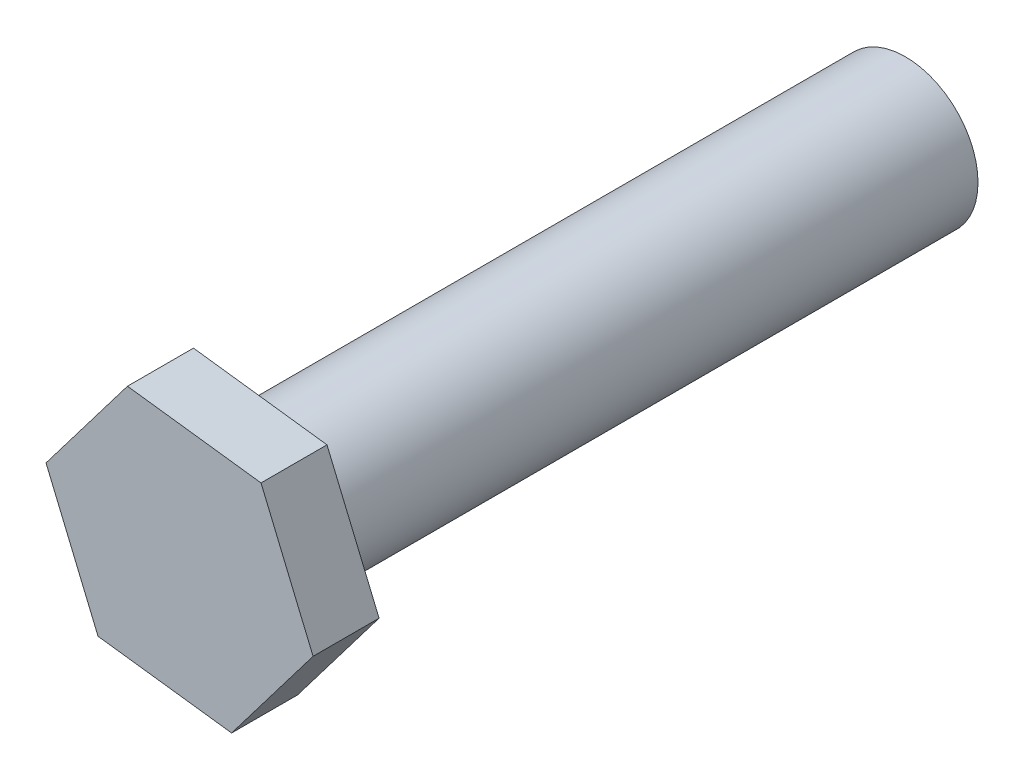
ISO-10303-21;
HEADER;
FILE_DESCRIPTION(('STEP AP214'),'2;1');
FILE_NAME('part.step','',(''),(''),'','','');
FILE_SCHEMA(('AUTOMOTIVE_DESIGN { 1 0 10303 214 1 1 1 1 }'));
ENDSEC;
DATA;
#1=APPLICATION_CONTEXT('core data for automotive mechanical design processes');
#2=APPLICATION_PROTOCOL_DEFINITION('international standard','automotive_design',2000,#1);
#3=PRODUCT_CONTEXT('',#1,'mechanical');
#4=PRODUCT('Part','Part','',(#3));
#5=PRODUCT_RELATED_PRODUCT_CATEGORY('part','',(#4));
#6=PRODUCT_DEFINITION_FORMATION('','',#4);
#7=PRODUCT_DEFINITION_CONTEXT('part definition',#1,'design');
#8=PRODUCT_DEFINITION('design','',#6,#7);
#9=PRODUCT_DEFINITION_SHAPE('','',#8);
#10=(LENGTH_UNIT() NAMED_UNIT(*) SI_UNIT(.MILLI.,.METRE.));
#11=(NAMED_UNIT(*) PLANE_ANGLE_UNIT() SI_UNIT($,.RADIAN.));
#12=(NAMED_UNIT(*) SI_UNIT($,.STERADIAN.) SOLID_ANGLE_UNIT());
#13=UNCERTAINTY_MEASURE_WITH_UNIT(LENGTH_MEASURE(1.E-05),#10,'distance_accuracy_value','');
#14=(GEOMETRIC_REPRESENTATION_CONTEXT(3) GLOBAL_UNCERTAINTY_ASSIGNED_CONTEXT((#13)) GLOBAL_UNIT_ASSIGNED_CONTEXT((#10,
#11,#12)) REPRESENTATION_CONTEXT('',''));
#15=CARTESIAN_POINT('',(0.,0.,0.));
#16=DIRECTION('',(0.,0.,1.));
#17=DIRECTION('',(1.,0.,0.));
#18=AXIS2_PLACEMENT_3D('',#15,#16,#17);
#19=CARTESIAN_POINT('',(0.,0.,15.));
#20=DIRECTION('',(0.,0.,-1.));
#21=DIRECTION('',(-1.,0.,0.));
#22=AXIS2_PLACEMENT_3D('',#19,#20,#21);
#23=CYLINDRICAL_SURFACE('',#22,1.65);
#24=CARTESIAN_POINT('',(0.,0.,15.));
#25=DIRECTION('',(0.,0.,1.));
#26=DIRECTION('',(1.,0.,0.));
#27=AXIS2_PLACEMENT_3D('',#24,#25,#26);
#28=CIRCLE('',#27,1.65);
#29=CARTESIAN_POINT('',(1.65,0.,15.));
#30=VERTEX_POINT('',#29);
#31=EDGE_CURVE('E11',#30,#30,#28,.T.);
#32=ORIENTED_EDGE('',*,*,#31,.F.);
#33=EDGE_LOOP('',(#32));
#34=FACE_BOUND('',#33,.T.);
#35=CARTESIAN_POINT('',(0.,0.,0.));
#36=DIRECTION('',(0.,0.,1.));
#37=DIRECTION('',(1.,0.,0.));
#38=AXIS2_PLACEMENT_3D('',#35,#36,#37);
#39=CIRCLE('',#38,1.65);
#40=CARTESIAN_POINT('',(1.65,0.,0.));
#41=VERTEX_POINT('',#40);
#42=EDGE_CURVE('E46',#41,#41,#39,.T.);
#43=ORIENTED_EDGE('',*,*,#42,.T.);
#44=EDGE_LOOP('',(#43));
#45=FACE_BOUND('',#44,.T.);
#46=ADVANCED_FACE('F43',(#34,#45),#23,.T.);
#47=CARTESIAN_POINT('',(0.,0.,0.));
#48=DIRECTION('',(0.,0.,1.));
#49=DIRECTION('',(1.,0.,0.));
#50=AXIS2_PLACEMENT_3D('',#47,#48,#49);
#51=PLANE('',#50);
#52=ORIENTED_EDGE('',*,*,#42,.F.);
#53=EDGE_LOOP('',(#52));
#54=FACE_BOUND('',#53,.T.);
#55=ADVANCED_FACE('F181',(#54),#51,.F.);
#56=CARTESIAN_POINT('',(1.18350760395935,-2.82181556532381,16.5));
#57=DIRECTION('',(-0.126132558193535,-0.992013395959729,0.));
#58=DIRECTION('',(0.992013395959729,-0.126132558193535,0.));
#59=AXIS2_PLACEMENT_3D('',#56,#57,#58);
#60=PLANE('',#59);
#61=DIRECTION('',(-0.992013395959729,0.126132558193535,0.));
#62=VECTOR('',#61,1.);
#63=CARTESIAN_POINT('',(1.18350760395935,-2.82181556532381,15.));
#64=LINE('',#63,#62);
#65=CARTESIAN_POINT('',(1.18350760395935,-2.82181556532381,15.));
#66=VERTEX_POINT('',#65);
#67=CARTESIAN_POINT('',(-1.85201016238509,-2.43585543326276,15.));
#68=VERTEX_POINT('',#67);
#69=EDGE_CURVE('E136',#66,#68,#64,.T.);
#70=ORIENTED_EDGE('',*,*,#69,.F.);
#71=DIRECTION('',(0.,0.,-1.));
#72=VECTOR('',#71,1.);
#73=CARTESIAN_POINT('',(1.18350760395935,-2.82181556532381,16.5));
#74=LINE('',#73,#72);
#75=CARTESIAN_POINT('',(1.18350760395935,-2.82181556532381,16.5));
#76=VERTEX_POINT('',#75);
#77=EDGE_CURVE('E60',#76,#66,#74,.T.);
#78=ORIENTED_EDGE('',*,*,#77,.F.);
#79=DIRECTION('',(-0.992013395959729,0.126132558193535,0.));
#80=VECTOR('',#79,1.);
#81=CARTESIAN_POINT('',(1.18350760395935,-2.82181556532381,16.5));
#82=LINE('',#81,#80);
#83=CARTESIAN_POINT('',(-1.85201016238509,-2.43585543326276,16.5));
#84=VERTEX_POINT('',#83);
#85=EDGE_CURVE('E157',#76,#84,#82,.T.);
#86=ORIENTED_EDGE('',*,*,#85,.T.);
#87=DIRECTION('',(0.,0.,-1.));
#88=VECTOR('',#87,1.);
#89=CARTESIAN_POINT('',(-1.85201016238509,-2.43585543326276,16.5));
#90=LINE('',#89,#88);
#91=EDGE_CURVE('E95',#84,#68,#90,.T.);
#92=ORIENTED_EDGE('',*,*,#91,.T.);
#93=EDGE_LOOP('',(#70,#78,#86,#92));
#94=FACE_BOUND('',#93,.T.);
#95=ADVANCED_FACE('F168',(#94),#60,.T.);
#96=CARTESIAN_POINT('',(3.03551776634444,-0.385960132061052,16.5));
#97=DIRECTION('',(0.796042522698829,-0.605240697619785,0.));
#98=DIRECTION('',(0.605240697619785,0.796042522698829,0.));
#99=AXIS2_PLACEMENT_3D('',#96,#97,#98);
#100=PLANE('',#99);
#101=DIRECTION('',(-0.605240697619785,-0.796042522698829,0.));
#102=VECTOR('',#101,1.);
#103=CARTESIAN_POINT('',(3.03551776634444,-0.385960132061052,15.));
#104=LINE('',#103,#102);
#105=CARTESIAN_POINT('',(3.03551776634444,-0.385960132061052,15.));
#106=VERTEX_POINT('',#105);
#107=EDGE_CURVE('E153',#106,#66,#104,.T.);
#108=ORIENTED_EDGE('',*,*,#107,.F.);
#109=DIRECTION('',(0.,0.,-1.));
#110=VECTOR('',#109,1.);
#111=CARTESIAN_POINT('',(3.03551776634444,-0.385960132061052,16.5));
#112=LINE('',#111,#110);
#113=CARTESIAN_POINT('',(3.03551776634444,-0.385960132061052,16.5));
#114=VERTEX_POINT('',#113);
#115=EDGE_CURVE('E83',#114,#106,#112,.T.);
#116=ORIENTED_EDGE('',*,*,#115,.F.);
#117=DIRECTION('',(-0.605240697619785,-0.796042522698829,0.));
#118=VECTOR('',#117,1.);
#119=CARTESIAN_POINT('',(3.03551776634444,-0.385960132061052,16.5));
#120=LINE('',#119,#118);
#121=EDGE_CURVE('E122',#114,#76,#120,.T.);
#122=ORIENTED_EDGE('',*,*,#121,.T.);
#123=ORIENTED_EDGE('',*,*,#77,.T.);
#124=EDGE_LOOP('',(#108,#116,#122,#123));
#125=FACE_BOUND('',#124,.T.);
#126=ADVANCED_FACE('F173',(#125),#100,.T.);
#127=CARTESIAN_POINT('',(1.85201016238509,2.43585543326276,16.5));
#128=DIRECTION('',(0.922175080892364,0.386772698339944,0.));
#129=DIRECTION('',(-0.386772698339944,0.922175080892364,0.));
#130=AXIS2_PLACEMENT_3D('',#127,#128,#129);
#131=PLANE('',#130);
#132=DIRECTION('',(0.386772698339944,-0.922175080892364,0.));
#133=VECTOR('',#132,1.);
#134=CARTESIAN_POINT('',(1.85201016238509,2.43585543326276,15.));
#135=LINE('',#134,#133);
#136=CARTESIAN_POINT('',(1.85201016238509,2.43585543326276,15.));
#137=VERTEX_POINT('',#136);
#138=EDGE_CURVE('E108',#137,#106,#135,.T.);
#139=ORIENTED_EDGE('',*,*,#138,.F.);
#140=DIRECTION('',(0.,0.,-1.));
#141=VECTOR('',#140,1.);
#142=CARTESIAN_POINT('',(1.85201016238509,2.43585543326276,16.5));
#143=LINE('',#142,#141);
#144=CARTESIAN_POINT('',(1.85201016238509,2.43585543326276,16.5));
#145=VERTEX_POINT('',#144);
#146=EDGE_CURVE('E103',#145,#137,#143,.T.);
#147=ORIENTED_EDGE('',*,*,#146,.F.);
#148=DIRECTION('',(0.386772698339944,-0.922175080892364,0.));
#149=VECTOR('',#148,1.);
#150=CARTESIAN_POINT('',(1.85201016238509,2.43585543326276,16.5));
#151=LINE('',#150,#149);
#152=EDGE_CURVE('E106',#145,#114,#151,.T.);
#153=ORIENTED_EDGE('',*,*,#152,.T.);
#154=ORIENTED_EDGE('',*,*,#115,.T.);
#155=EDGE_LOOP('',(#139,#147,#153,#154));
#156=FACE_BOUND('',#155,.T.);
#157=ADVANCED_FACE('F105',(#156),#131,.T.);
#158=CARTESIAN_POINT('',(-1.18350760395935,2.82181556532381,16.5));
#159=DIRECTION('',(0.126132558193535,0.992013395959729,0.));
#160=DIRECTION('',(-0.992013395959729,0.126132558193535,0.));
#161=AXIS2_PLACEMENT_3D('',#158,#159,#160);
#162=PLANE('',#161);
#163=DIRECTION('',(0.992013395959729,-0.126132558193535,0.));
#164=VECTOR('',#163,1.);
#165=CARTESIAN_POINT('',(-1.18350760395935,2.82181556532381,15.));
#166=LINE('',#165,#164);
#167=CARTESIAN_POINT('',(-1.18350760395935,2.82181556532381,15.));
#168=VERTEX_POINT('',#167);
#169=EDGE_CURVE('E148',#168,#137,#166,.T.);
#170=ORIENTED_EDGE('',*,*,#169,.F.);
#171=DIRECTION('',(0.,0.,-1.));
#172=VECTOR('',#171,1.);
#173=CARTESIAN_POINT('',(-1.18350760395935,2.82181556532381,16.5));
#174=LINE('',#173,#172);
#175=CARTESIAN_POINT('',(-1.18350760395935,2.82181556532381,16.5));
#176=VERTEX_POINT('',#175);
#177=EDGE_CURVE('E114',#176,#168,#174,.T.);
#178=ORIENTED_EDGE('',*,*,#177,.F.);
#179=DIRECTION('',(0.992013395959729,-0.126132558193535,0.));
#180=VECTOR('',#179,1.);
#181=CARTESIAN_POINT('',(-1.18350760395935,2.82181556532381,16.5));
#182=LINE('',#181,#180);
#183=EDGE_CURVE('E120',#176,#145,#182,.T.);
#184=ORIENTED_EDGE('',*,*,#183,.T.);
#185=ORIENTED_EDGE('',*,*,#146,.T.);
#186=EDGE_LOOP('',(#170,#178,#184,#185));
#187=FACE_BOUND('',#186,.T.);
#188=ADVANCED_FACE('F125',(#187),#162,.T.);
#189=CARTESIAN_POINT('',(-3.03551776634444,0.385960132061052,16.5));
#190=DIRECTION('',(-0.796042522698829,0.605240697619785,0.));
#191=DIRECTION('',(-0.605240697619785,-0.796042522698829,0.));
#192=AXIS2_PLACEMENT_3D('',#189,#190,#191);
#193=PLANE('',#192);
#194=DIRECTION('',(0.605240697619785,0.796042522698829,0.));
#195=VECTOR('',#194,1.);
#196=CARTESIAN_POINT('',(-3.03551776634444,0.385960132061052,15.));
#197=LINE('',#196,#195);
#198=CARTESIAN_POINT('',(-3.03551776634444,0.385960132061052,15.));
#199=VERTEX_POINT('',#198);
#200=EDGE_CURVE('E144',#199,#168,#197,.T.);
#201=ORIENTED_EDGE('',*,*,#200,.F.);
#202=DIRECTION('',(0.,0.,-1.));
#203=VECTOR('',#202,1.);
#204=CARTESIAN_POINT('',(-3.03551776634444,0.385960132061052,16.5));
#205=LINE('',#204,#203);
#206=CARTESIAN_POINT('',(-3.03551776634444,0.385960132061052,16.5));
#207=VERTEX_POINT('',#206);
#208=EDGE_CURVE('E164',#207,#199,#205,.T.);
#209=ORIENTED_EDGE('',*,*,#208,.F.);
#210=DIRECTION('',(0.605240697619785,0.796042522698829,0.));
#211=VECTOR('',#210,1.);
#212=CARTESIAN_POINT('',(-3.03551776634444,0.385960132061052,16.5));
#213=LINE('',#212,#211);
#214=EDGE_CURVE('E127',#207,#176,#213,.T.);
#215=ORIENTED_EDGE('',*,*,#214,.T.);
#216=ORIENTED_EDGE('',*,*,#177,.T.);
#217=EDGE_LOOP('',(#201,#209,#215,#216));
#218=FACE_BOUND('',#217,.T.);
#219=ADVANCED_FACE('F204',(#218),#193,.T.);
#220=CARTESIAN_POINT('',(-1.85201016238509,-2.43585543326276,16.5));
#221=DIRECTION('',(-0.922175080892364,-0.386772698339944,0.));
#222=DIRECTION('',(0.386772698339944,-0.922175080892364,0.));
#223=AXIS2_PLACEMENT_3D('',#220,#221,#222);
#224=PLANE('',#223);
#225=DIRECTION('',(-0.386772698339944,0.922175080892364,0.));
#226=VECTOR('',#225,1.);
#227=CARTESIAN_POINT('',(-1.85201016238509,-2.43585543326276,15.));
#228=LINE('',#227,#226);
#229=EDGE_CURVE('E140',#68,#199,#228,.T.);
#230=ORIENTED_EDGE('',*,*,#229,.F.);
#231=ORIENTED_EDGE('',*,*,#91,.F.);
#232=DIRECTION('',(-0.386772698339944,0.922175080892364,0.));
#233=VECTOR('',#232,1.);
#234=CARTESIAN_POINT('',(-1.85201016238509,-2.43585543326276,16.5));
#235=LINE('',#234,#233);
#236=EDGE_CURVE('E130',#84,#207,#235,.T.);
#237=ORIENTED_EDGE('',*,*,#236,.T.);
#238=ORIENTED_EDGE('',*,*,#208,.T.);
#239=EDGE_LOOP('',(#230,#231,#237,#238));
#240=FACE_BOUND('',#239,.T.);
#241=ADVANCED_FACE('F169',(#240),#224,.T.);
#242=CARTESIAN_POINT('',(0.,0.,16.5));
#243=DIRECTION('',(0.,0.,-1.));
#244=DIRECTION('',(-1.,0.,0.));
#245=AXIS2_PLACEMENT_3D('',#242,#243,#244);
#246=PLANE('',#245);
#247=ORIENTED_EDGE('',*,*,#85,.F.);
#248=ORIENTED_EDGE('',*,*,#121,.F.);
#249=ORIENTED_EDGE('',*,*,#152,.F.);
#250=ORIENTED_EDGE('',*,*,#183,.F.);
#251=ORIENTED_EDGE('',*,*,#214,.F.);
#252=ORIENTED_EDGE('',*,*,#236,.F.);
#253=EDGE_LOOP('',(#247,#248,#249,#250,#251,#252));
#254=FACE_BOUND('',#253,.T.);
#255=ADVANCED_FACE('F118',(#254),#246,.F.);
#256=CARTESIAN_POINT('',(0.,0.,15.));
#257=DIRECTION('',(0.,0.,-1.));
#258=DIRECTION('',(-1.,0.,0.));
#259=AXIS2_PLACEMENT_3D('',#256,#257,#258);
#260=PLANE('',#259);
#261=ORIENTED_EDGE('',*,*,#31,.T.);
#262=EDGE_LOOP('',(#261));
#263=FACE_BOUND('',#262,.T.);
#264=ORIENTED_EDGE('',*,*,#69,.T.);
#265=ORIENTED_EDGE('',*,*,#229,.T.);
#266=ORIENTED_EDGE('',*,*,#200,.T.);
#267=ORIENTED_EDGE('',*,*,#169,.T.);
#268=ORIENTED_EDGE('',*,*,#138,.T.);
#269=ORIENTED_EDGE('',*,*,#107,.T.);
#270=EDGE_LOOP('',(#264,#265,#266,#267,#268,#269));
#271=FACE_BOUND('',#270,.T.);
#272=ADVANCED_FACE('F172',(#263,#271),#260,.T.);
#273=CLOSED_SHELL('',(#46,#55,#95,#126,#157,#188,#219,#241,#255,#272));
#274=MANIFOLD_SOLID_BREP('B2',#273);
#275=ADVANCED_BREP_SHAPE_REPRESENTATION('',(#18,#274),#14);
#276=SHAPE_DEFINITION_REPRESENTATION(#9,#275);
ENDSEC;
END-ISO-10303-21;
